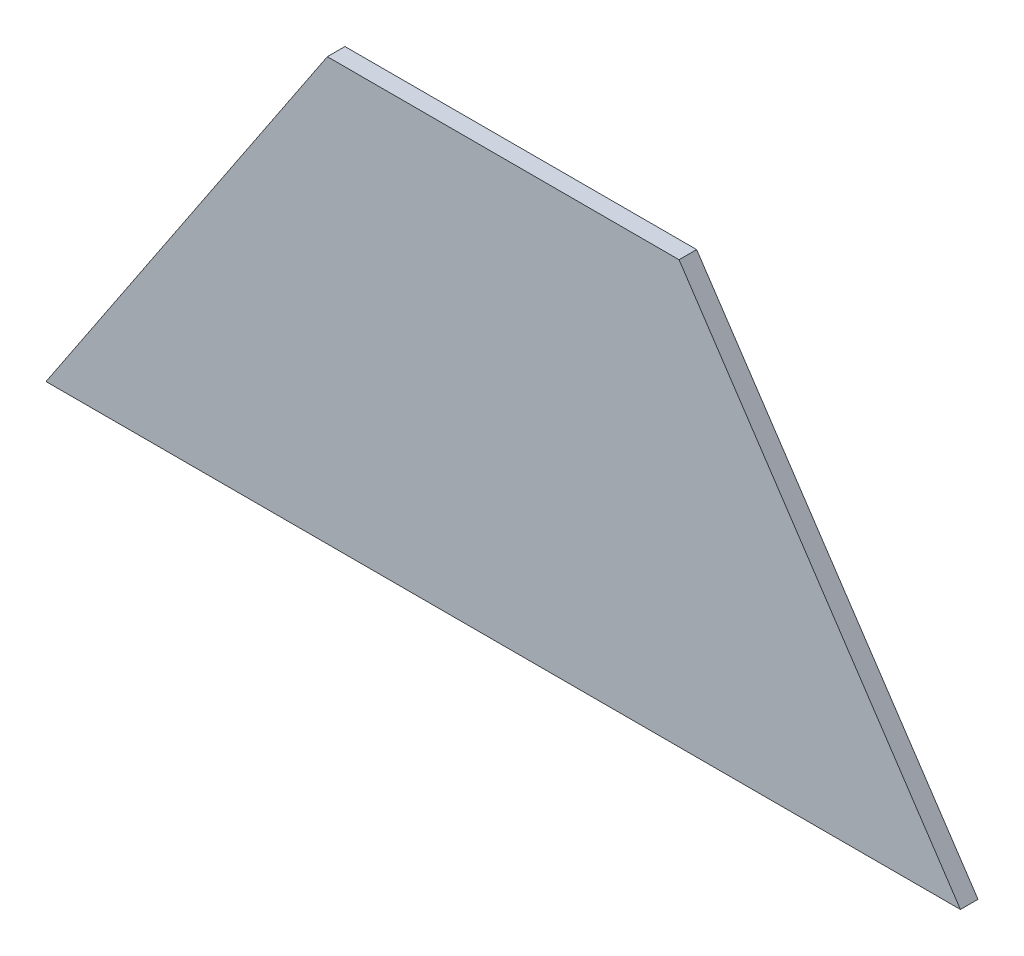
ISO-10303-21;
HEADER;
FILE_DESCRIPTION(('STEP AP214'),'2;1');
FILE_NAME('part.step','',(''),(''),'','','');
FILE_SCHEMA(('AUTOMOTIVE_DESIGN { 1 0 10303 214 1 1 1 1 }'));
ENDSEC;
DATA;
#1=APPLICATION_CONTEXT('core data for automotive mechanical design processes');
#2=APPLICATION_PROTOCOL_DEFINITION('international standard','automotive_design',2000,#1);
#3=PRODUCT_CONTEXT('',#1,'mechanical');
#4=PRODUCT('Part','Part','',(#3));
#5=PRODUCT_RELATED_PRODUCT_CATEGORY('part','',(#4));
#6=PRODUCT_DEFINITION_FORMATION('','',#4);
#7=PRODUCT_DEFINITION_CONTEXT('part definition',#1,'design');
#8=PRODUCT_DEFINITION('design','',#6,#7);
#9=PRODUCT_DEFINITION_SHAPE('','',#8);
#10=(LENGTH_UNIT() NAMED_UNIT(*) SI_UNIT(.MILLI.,.METRE.));
#11=(NAMED_UNIT(*) PLANE_ANGLE_UNIT() SI_UNIT($,.RADIAN.));
#12=(NAMED_UNIT(*) SI_UNIT($,.STERADIAN.) SOLID_ANGLE_UNIT());
#13=UNCERTAINTY_MEASURE_WITH_UNIT(LENGTH_MEASURE(1.E-05),#10,'distance_accuracy_value','');
#14=(GEOMETRIC_REPRESENTATION_CONTEXT(3) GLOBAL_UNCERTAINTY_ASSIGNED_CONTEXT((#13)) GLOBAL_UNIT_ASSIGNED_CONTEXT((#10,
#11,#12)) REPRESENTATION_CONTEXT('',''));
#15=CARTESIAN_POINT('',(0.,0.,0.));
#16=DIRECTION('',(0.,0.,1.));
#17=DIRECTION('',(1.,0.,0.));
#18=AXIS2_PLACEMENT_3D('',#15,#16,#17);
#19=CARTESIAN_POINT('',(0.,0.,3.175));
#20=DIRECTION('',(0.832050294337844,-0.554700196225229,0.));
#21=DIRECTION('',(0.554700196225229,0.832050294337844,0.));
#22=AXIS2_PLACEMENT_3D('',#19,#20,#21);
#23=PLANE('',#22);
#24=DIRECTION('',(-0.554700196225229,-0.832050294337844,0.));
#25=VECTOR('',#24,1.);
#26=CARTESIAN_POINT('',(0.,0.,0.));
#27=LINE('',#26,#25);
#28=CARTESIAN_POINT('',(50.8,76.2,0.));
#29=VERTEX_POINT('',#28);
#30=CARTESIAN_POINT('',(0.,0.,0.));
#31=VERTEX_POINT('',#30);
#32=EDGE_CURVE('E113',#29,#31,#27,.T.);
#33=ORIENTED_EDGE('',*,*,#32,.T.);
#34=DIRECTION('',(0.,0.,-1.));
#35=VECTOR('',#34,1.);
#36=CARTESIAN_POINT('',(0.,0.,3.175));
#37=LINE('',#36,#35);
#38=CARTESIAN_POINT('',(0.,0.,3.175));
#39=VERTEX_POINT('',#38);
#40=EDGE_CURVE('E11',#39,#31,#37,.T.);
#41=ORIENTED_EDGE('',*,*,#40,.F.);
#42=DIRECTION('',(-0.554700196225229,-0.832050294337844,0.));
#43=VECTOR('',#42,1.);
#44=CARTESIAN_POINT('',(0.,0.,3.175));
#45=LINE('',#44,#43);
#46=CARTESIAN_POINT('',(50.8,76.2,3.175));
#47=VERTEX_POINT('',#46);
#48=EDGE_CURVE('E97',#47,#39,#45,.T.);
#49=ORIENTED_EDGE('',*,*,#48,.F.);
#50=DIRECTION('',(0.,0.,-1.));
#51=VECTOR('',#50,1.);
#52=CARTESIAN_POINT('',(50.8,76.2,3.175));
#53=LINE('',#52,#51);
#54=EDGE_CURVE('E109',#47,#29,#53,.T.);
#55=ORIENTED_EDGE('',*,*,#54,.T.);
#56=EDGE_LOOP('',(#33,#41,#49,#55));
#57=FACE_BOUND('',#56,.T.);
#58=ADVANCED_FACE('F45',(#57),#23,.F.);
#59=CARTESIAN_POINT('',(0.,0.,3.175));
#60=DIRECTION('',(0.,1.,0.));
#61=DIRECTION('',(0.,0.,1.));
#62=AXIS2_PLACEMENT_3D('',#59,#60,#61);
#63=PLANE('',#62);
#64=DIRECTION('',(1.,0.,0.));
#65=VECTOR('',#64,1.);
#66=CARTESIAN_POINT('',(0.,0.,0.));
#67=LINE('',#66,#65);
#68=CARTESIAN_POINT('',(165.1,0.,0.));
#69=VERTEX_POINT('',#68);
#70=EDGE_CURVE('E102',#31,#69,#67,.T.);
#71=ORIENTED_EDGE('',*,*,#70,.T.);
#72=DIRECTION('',(0.,0.,-1.));
#73=VECTOR('',#72,1.);
#74=CARTESIAN_POINT('',(165.1,0.,3.175));
#75=LINE('',#74,#73);
#76=CARTESIAN_POINT('',(165.1,0.,3.175));
#77=VERTEX_POINT('',#76);
#78=EDGE_CURVE('E54',#77,#69,#75,.T.);
#79=ORIENTED_EDGE('',*,*,#78,.F.);
#80=DIRECTION('',(1.,0.,0.));
#81=VECTOR('',#80,1.);
#82=CARTESIAN_POINT('',(0.,0.,3.175));
#83=LINE('',#82,#81);
#84=EDGE_CURVE('E92',#39,#77,#83,.T.);
#85=ORIENTED_EDGE('',*,*,#84,.F.);
#86=ORIENTED_EDGE('',*,*,#40,.T.);
#87=EDGE_LOOP('',(#71,#79,#85,#86));
#88=FACE_BOUND('',#87,.T.);
#89=ADVANCED_FACE('F101',(#88),#63,.F.);
#90=CARTESIAN_POINT('',(165.1,0.,3.175));
#91=DIRECTION('',(-0.832050294337844,-0.554700196225229,0.));
#92=DIRECTION('',(0.554700196225229,-0.832050294337844,0.));
#93=AXIS2_PLACEMENT_3D('',#90,#91,#92);
#94=PLANE('',#93);
#95=DIRECTION('',(-0.554700196225229,0.832050294337844,0.));
#96=VECTOR('',#95,1.);
#97=CARTESIAN_POINT('',(165.1,0.,0.));
#98=LINE('',#97,#96);
#99=CARTESIAN_POINT('',(114.3,76.2,0.));
#100=VERTEX_POINT('',#99);
#101=EDGE_CURVE('E79',#69,#100,#98,.T.);
#102=ORIENTED_EDGE('',*,*,#101,.T.);
#103=DIRECTION('',(0.,0.,-1.));
#104=VECTOR('',#103,1.);
#105=CARTESIAN_POINT('',(114.3,76.2,3.175));
#106=LINE('',#105,#104);
#107=CARTESIAN_POINT('',(114.3,76.2,3.175));
#108=VERTEX_POINT('',#107);
#109=EDGE_CURVE('E104',#108,#100,#106,.T.);
#110=ORIENTED_EDGE('',*,*,#109,.F.);
#111=DIRECTION('',(-0.554700196225229,0.832050294337844,0.));
#112=VECTOR('',#111,1.);
#113=CARTESIAN_POINT('',(165.1,0.,3.175));
#114=LINE('',#113,#112);
#115=EDGE_CURVE('E95',#77,#108,#114,.T.);
#116=ORIENTED_EDGE('',*,*,#115,.F.);
#117=ORIENTED_EDGE('',*,*,#78,.T.);
#118=EDGE_LOOP('',(#102,#110,#116,#117));
#119=FACE_BOUND('',#118,.T.);
#120=ADVANCED_FACE('F105',(#119),#94,.F.);
#121=CARTESIAN_POINT('',(114.3,76.2,3.175));
#122=DIRECTION('',(0.,-1.,0.));
#123=DIRECTION('',(1.,0.,0.));
#124=AXIS2_PLACEMENT_3D('',#121,#122,#123);
#125=PLANE('',#124);
#126=DIRECTION('',(-1.,0.,0.));
#127=VECTOR('',#126,1.);
#128=CARTESIAN_POINT('',(114.3,76.2,0.));
#129=LINE('',#128,#127);
#130=EDGE_CURVE('E85',#100,#29,#129,.T.);
#131=ORIENTED_EDGE('',*,*,#130,.T.);
#132=ORIENTED_EDGE('',*,*,#54,.F.);
#133=DIRECTION('',(-1.,0.,0.));
#134=VECTOR('',#133,1.);
#135=CARTESIAN_POINT('',(114.3,76.2,3.175));
#136=LINE('',#135,#134);
#137=EDGE_CURVE('E62',#108,#47,#136,.T.);
#138=ORIENTED_EDGE('',*,*,#137,.F.);
#139=ORIENTED_EDGE('',*,*,#109,.T.);
#140=EDGE_LOOP('',(#131,#132,#138,#139));
#141=FACE_BOUND('',#140,.T.);
#142=ADVANCED_FACE('F126',(#141),#125,.F.);
#143=CARTESIAN_POINT('',(0.,0.,3.175));
#144=DIRECTION('',(0.,0.,1.));
#145=DIRECTION('',(1.,0.,0.));
#146=AXIS2_PLACEMENT_3D('',#143,#144,#145);
#147=PLANE('',#146);
#148=ORIENTED_EDGE('',*,*,#48,.T.);
#149=ORIENTED_EDGE('',*,*,#84,.T.);
#150=ORIENTED_EDGE('',*,*,#115,.T.);
#151=ORIENTED_EDGE('',*,*,#137,.T.);
#152=EDGE_LOOP('',(#148,#149,#150,#151));
#153=FACE_BOUND('',#152,.T.);
#154=ADVANCED_FACE('F93',(#153),#147,.T.);
#155=CARTESIAN_POINT('',(0.,0.,0.));
#156=DIRECTION('',(0.,0.,1.));
#157=DIRECTION('',(1.,0.,0.));
#158=AXIS2_PLACEMENT_3D('',#155,#156,#157);
#159=PLANE('',#158);
#160=ORIENTED_EDGE('',*,*,#32,.F.);
#161=ORIENTED_EDGE('',*,*,#130,.F.);
#162=ORIENTED_EDGE('',*,*,#101,.F.);
#163=ORIENTED_EDGE('',*,*,#70,.F.);
#164=EDGE_LOOP('',(#160,#161,#162,#163));
#165=FACE_BOUND('',#164,.T.);
#166=ADVANCED_FACE('F129',(#165),#159,.F.);
#167=CLOSED_SHELL('',(#58,#89,#120,#142,#154,#166));
#168=MANIFOLD_SOLID_BREP('B2',#167);
#169=ADVANCED_BREP_SHAPE_REPRESENTATION('',(#18,#168),#14);
#170=SHAPE_DEFINITION_REPRESENTATION(#9,#169);
ENDSEC;
END-ISO-10303-21;
